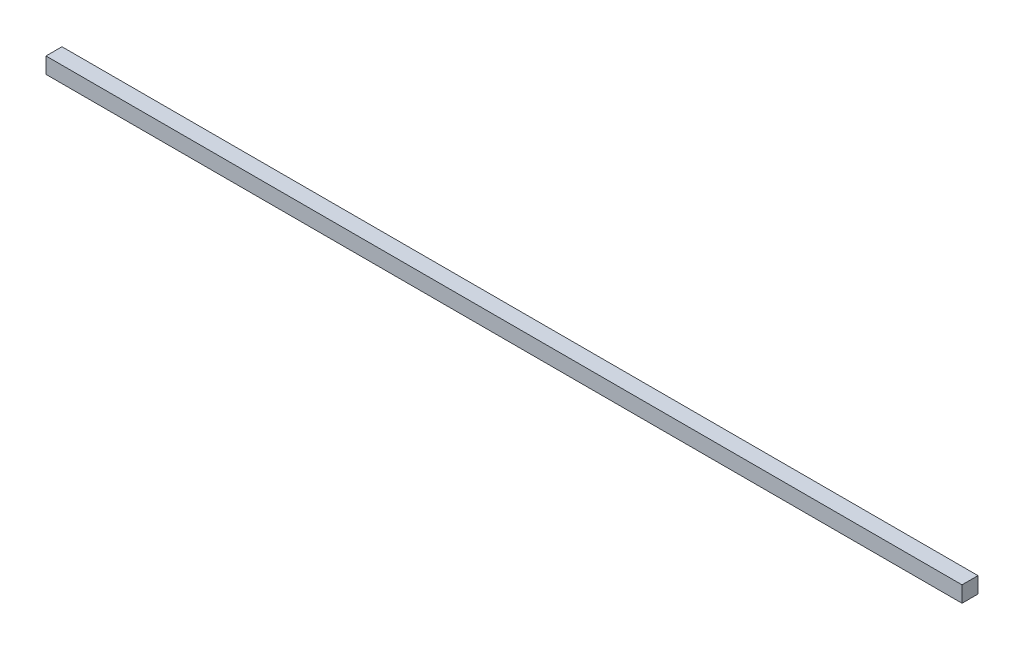
ISO-10303-21;
HEADER;
FILE_DESCRIPTION(('STEP AP214'),'2;1');
FILE_NAME('part.step','',(''),(''),'','','');
FILE_SCHEMA(('AUTOMOTIVE_DESIGN { 1 0 10303 214 1 1 1 1 }'));
ENDSEC;
DATA;
#1=APPLICATION_CONTEXT('core data for automotive mechanical design processes');
#2=APPLICATION_PROTOCOL_DEFINITION('international standard','automotive_design',2000,#1);
#3=PRODUCT_CONTEXT('',#1,'mechanical');
#4=PRODUCT('Part','Part','',(#3));
#5=PRODUCT_RELATED_PRODUCT_CATEGORY('part','',(#4));
#6=PRODUCT_DEFINITION_FORMATION('','',#4);
#7=PRODUCT_DEFINITION_CONTEXT('part definition',#1,'design');
#8=PRODUCT_DEFINITION('design','',#6,#7);
#9=PRODUCT_DEFINITION_SHAPE('','',#8);
#10=(LENGTH_UNIT() NAMED_UNIT(*) SI_UNIT(.MILLI.,.METRE.));
#11=(NAMED_UNIT(*) PLANE_ANGLE_UNIT() SI_UNIT($,.RADIAN.));
#12=(NAMED_UNIT(*) SI_UNIT($,.STERADIAN.) SOLID_ANGLE_UNIT());
#13=UNCERTAINTY_MEASURE_WITH_UNIT(LENGTH_MEASURE(1.E-05),#10,'distance_accuracy_value','');
#14=(GEOMETRIC_REPRESENTATION_CONTEXT(3) GLOBAL_UNCERTAINTY_ASSIGNED_CONTEXT((#13)) GLOBAL_UNIT_ASSIGNED_CONTEXT((#10,
#11,#12)) REPRESENTATION_CONTEXT('',''));
#15=CARTESIAN_POINT('',(0.,0.,0.));
#16=DIRECTION('',(0.,0.,1.));
#17=DIRECTION('',(1.,0.,0.));
#18=AXIS2_PLACEMENT_3D('',#15,#16,#17);
#19=CARTESIAN_POINT('',(573.4,-20.8928571428571,-4.64285714285712));
#20=DIRECTION('',(0.,0.,-1.));
#21=DIRECTION('',(-1.,0.,0.));
#22=AXIS2_PLACEMENT_3D('',#19,#20,#21);
#23=PLANE('',#22);
#24=DIRECTION('',(0.,-1.,0.));
#25=VECTOR('',#24,1.);
#26=CARTESIAN_POINT('',(-573.4,-20.8928571428571,-4.64285714285712));
#27=LINE('',#26,#25);
#28=CARTESIAN_POINT('',(-573.4,-20.8928571428571,-4.64285714285712));
#29=VERTEX_POINT('',#28);
#30=CARTESIAN_POINT('',(-573.4,-40.8928571428572,-4.64285714285712));
#31=VERTEX_POINT('',#30);
#32=EDGE_CURVE('E102',#29,#31,#27,.T.);
#33=ORIENTED_EDGE('',*,*,#32,.T.);
#34=DIRECTION('',(-1.,0.,0.));
#35=VECTOR('',#34,1.);
#36=CARTESIAN_POINT('',(573.4,-40.8928571428572,-4.64285714285712));
#37=LINE('',#36,#35);
#38=CARTESIAN_POINT('',(573.4,-40.8928571428572,-4.64285714285712));
#39=VERTEX_POINT('',#38);
#40=EDGE_CURVE('E11',#39,#31,#37,.T.);
#41=ORIENTED_EDGE('',*,*,#40,.F.);
#42=DIRECTION('',(0.,-1.,0.));
#43=VECTOR('',#42,1.);
#44=CARTESIAN_POINT('',(573.4,-20.8928571428571,-4.64285714285712));
#45=LINE('',#44,#43);
#46=CARTESIAN_POINT('',(573.4,-20.8928571428571,-4.64285714285712));
#47=VERTEX_POINT('',#46);
#48=EDGE_CURVE('E90',#47,#39,#45,.T.);
#49=ORIENTED_EDGE('',*,*,#48,.F.);
#50=DIRECTION('',(-1.,0.,0.));
#51=VECTOR('',#50,1.);
#52=CARTESIAN_POINT('',(573.4,-20.8928571428571,-4.64285714285712));
#53=LINE('',#52,#51);
#54=EDGE_CURVE('E98',#47,#29,#53,.T.);
#55=ORIENTED_EDGE('',*,*,#54,.T.);
#56=EDGE_LOOP('',(#33,#41,#49,#55));
#57=FACE_BOUND('',#56,.T.);
#58=ADVANCED_FACE('F39',(#57),#23,.F.);
#59=CARTESIAN_POINT('',(573.4,-40.8928571428572,-4.64285714285712));
#60=DIRECTION('',(0.,1.,0.));
#61=DIRECTION('',(0.,0.,1.));
#62=AXIS2_PLACEMENT_3D('',#59,#60,#61);
#63=PLANE('',#62);
#64=DIRECTION('',(0.,0.,-1.));
#65=VECTOR('',#64,1.);
#66=CARTESIAN_POINT('',(-573.4,-40.8928571428572,-4.64285714285712));
#67=LINE('',#66,#65);
#68=CARTESIAN_POINT('',(-573.4,-40.8928571428571,-24.6428571428571));
#69=VERTEX_POINT('',#68);
#70=EDGE_CURVE('E94',#31,#69,#67,.T.);
#71=ORIENTED_EDGE('',*,*,#70,.T.);
#72=DIRECTION('',(-1.,0.,0.));
#73=VECTOR('',#72,1.);
#74=CARTESIAN_POINT('',(573.4,-40.8928571428571,-24.6428571428571));
#75=LINE('',#74,#73);
#76=CARTESIAN_POINT('',(573.4,-40.8928571428571,-24.6428571428571));
#77=VERTEX_POINT('',#76);
#78=EDGE_CURVE('E47',#77,#69,#75,.T.);
#79=ORIENTED_EDGE('',*,*,#78,.F.);
#80=DIRECTION('',(0.,0.,-1.));
#81=VECTOR('',#80,1.);
#82=CARTESIAN_POINT('',(573.4,-40.8928571428572,-4.64285714285712));
#83=LINE('',#82,#81);
#84=EDGE_CURVE('E85',#39,#77,#83,.T.);
#85=ORIENTED_EDGE('',*,*,#84,.F.);
#86=ORIENTED_EDGE('',*,*,#40,.T.);
#87=EDGE_LOOP('',(#71,#79,#85,#86));
#88=FACE_BOUND('',#87,.T.);
#89=ADVANCED_FACE('F93',(#88),#63,.F.);
#90=CARTESIAN_POINT('',(573.4,-20.8928571428571,-24.6428571428571));
#91=DIRECTION('',(0.,0.,1.));
#92=DIRECTION('',(0.,-1.,0.));
#93=AXIS2_PLACEMENT_3D('',#90,#91,#92);
#94=PLANE('',#93);
#95=DIRECTION('',(0.,1.,0.));
#96=VECTOR('',#95,1.);
#97=CARTESIAN_POINT('',(-573.4,-20.8928571428571,-24.6428571428571));
#98=LINE('',#97,#96);
#99=CARTESIAN_POINT('',(-573.4,-20.8928571428571,-24.6428571428571));
#100=VERTEX_POINT('',#99);
#101=EDGE_CURVE('E72',#69,#100,#98,.T.);
#102=ORIENTED_EDGE('',*,*,#101,.T.);
#103=DIRECTION('',(-1.,0.,0.));
#104=VECTOR('',#103,1.);
#105=CARTESIAN_POINT('',(573.4,-20.8928571428571,-24.6428571428571));
#106=LINE('',#105,#104);
#107=CARTESIAN_POINT('',(573.4,-20.8928571428571,-24.6428571428571));
#108=VERTEX_POINT('',#107);
#109=EDGE_CURVE('E95',#108,#100,#106,.T.);
#110=ORIENTED_EDGE('',*,*,#109,.F.);
#111=DIRECTION('',(0.,1.,0.));
#112=VECTOR('',#111,1.);
#113=CARTESIAN_POINT('',(573.4,-20.8928571428571,-24.6428571428571));
#114=LINE('',#113,#112);
#115=EDGE_CURVE('E88',#77,#108,#114,.T.);
#116=ORIENTED_EDGE('',*,*,#115,.F.);
#117=ORIENTED_EDGE('',*,*,#78,.T.);
#118=EDGE_LOOP('',(#102,#110,#116,#117));
#119=FACE_BOUND('',#118,.T.);
#120=ADVANCED_FACE('F96',(#119),#94,.F.);
#121=CARTESIAN_POINT('',(573.4,-20.8928571428571,-4.64285714285712));
#122=DIRECTION('',(0.,-1.,0.));
#123=DIRECTION('',(0.,0.,-1.));
#124=AXIS2_PLACEMENT_3D('',#121,#122,#123);
#125=PLANE('',#124);
#126=DIRECTION('',(0.,0.,1.));
#127=VECTOR('',#126,1.);
#128=CARTESIAN_POINT('',(-573.4,-20.8928571428571,-4.64285714285712));
#129=LINE('',#128,#127);
#130=EDGE_CURVE('E78',#100,#29,#129,.T.);
#131=ORIENTED_EDGE('',*,*,#130,.T.);
#132=ORIENTED_EDGE('',*,*,#54,.F.);
#133=DIRECTION('',(0.,0.,1.));
#134=VECTOR('',#133,1.);
#135=CARTESIAN_POINT('',(573.4,-20.8928571428571,-4.64285714285712));
#136=LINE('',#135,#134);
#137=EDGE_CURVE('E55',#108,#47,#136,.T.);
#138=ORIENTED_EDGE('',*,*,#137,.F.);
#139=ORIENTED_EDGE('',*,*,#109,.T.);
#140=EDGE_LOOP('',(#131,#132,#138,#139));
#141=FACE_BOUND('',#140,.T.);
#142=ADVANCED_FACE('F109',(#141),#125,.F.);
#143=CARTESIAN_POINT('',(573.4,0.,0.));
#144=DIRECTION('',(1.,0.,0.));
#145=DIRECTION('',(0.,0.,-1.));
#146=AXIS2_PLACEMENT_3D('',#143,#144,#145);
#147=PLANE('',#146);
#148=ORIENTED_EDGE('',*,*,#48,.T.);
#149=ORIENTED_EDGE('',*,*,#84,.T.);
#150=ORIENTED_EDGE('',*,*,#115,.T.);
#151=ORIENTED_EDGE('',*,*,#137,.T.);
#152=EDGE_LOOP('',(#148,#149,#150,#151));
#153=FACE_BOUND('',#152,.T.);
#154=ADVANCED_FACE('F86',(#153),#147,.T.);
#155=CARTESIAN_POINT('',(-573.4,0.,0.));
#156=DIRECTION('',(1.,0.,0.));
#157=DIRECTION('',(0.,0.,-1.));
#158=AXIS2_PLACEMENT_3D('',#155,#156,#157);
#159=PLANE('',#158);
#160=ORIENTED_EDGE('',*,*,#32,.F.);
#161=ORIENTED_EDGE('',*,*,#130,.F.);
#162=ORIENTED_EDGE('',*,*,#101,.F.);
#163=ORIENTED_EDGE('',*,*,#70,.F.);
#164=EDGE_LOOP('',(#160,#161,#162,#163));
#165=FACE_BOUND('',#164,.T.);
#166=ADVANCED_FACE('F112',(#165),#159,.F.);
#167=CLOSED_SHELL('',(#58,#89,#120,#142,#154,#166));
#168=MANIFOLD_SOLID_BREP('B2',#167);
#169=ADVANCED_BREP_SHAPE_REPRESENTATION('',(#18,#168),#14);
#170=SHAPE_DEFINITION_REPRESENTATION(#9,#169);
ENDSEC;
END-ISO-10303-21;
